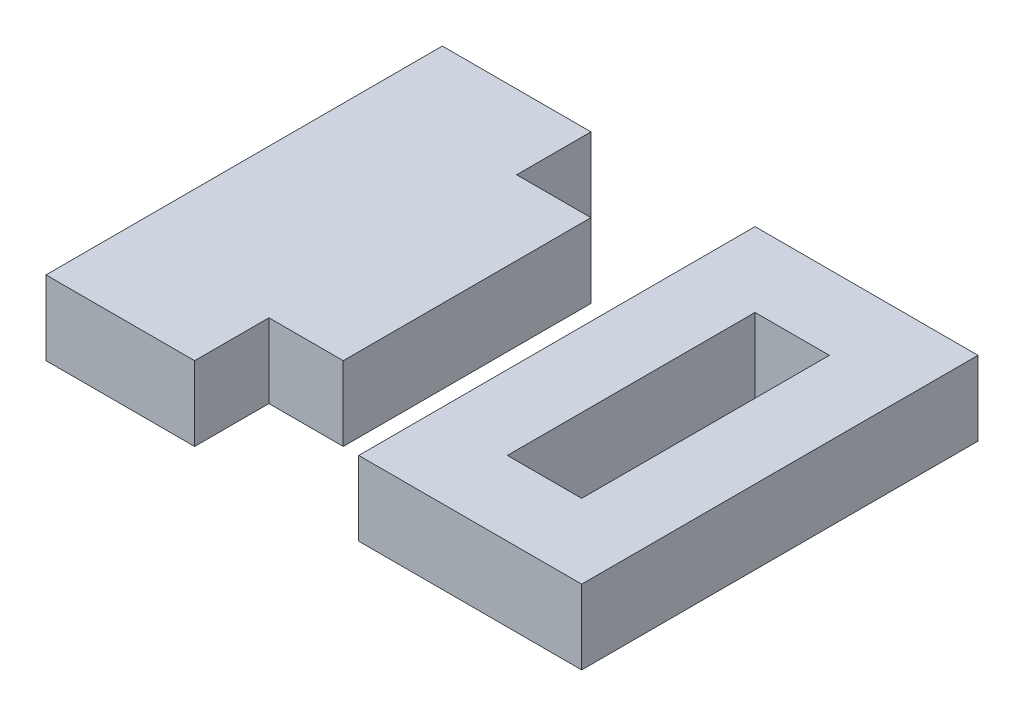
ISO-10303-21;
HEADER;
FILE_DESCRIPTION(('STEP AP214'),'2;1');
FILE_NAME('part.step','',(''),(''),'','','');
FILE_SCHEMA(('AUTOMOTIVE_DESIGN { 1 0 10303 214 1 1 1 1 }'));
ENDSEC;
DATA;
#1=APPLICATION_CONTEXT('core data for automotive mechanical design processes');
#2=APPLICATION_PROTOCOL_DEFINITION('international standard','automotive_design',2000,#1);
#3=PRODUCT_CONTEXT('',#1,'mechanical');
#4=PRODUCT('Part','Part','',(#3));
#5=PRODUCT_RELATED_PRODUCT_CATEGORY('part','',(#4));
#6=PRODUCT_DEFINITION_FORMATION('','',#4);
#7=PRODUCT_DEFINITION_CONTEXT('part definition',#1,'design');
#8=PRODUCT_DEFINITION('design','',#6,#7);
#9=PRODUCT_DEFINITION_SHAPE('','',#8);
#10=(LENGTH_UNIT() NAMED_UNIT(*) SI_UNIT(.MILLI.,.METRE.));
#11=(NAMED_UNIT(*) PLANE_ANGLE_UNIT() SI_UNIT($,.RADIAN.));
#12=(NAMED_UNIT(*) SI_UNIT($,.STERADIAN.) SOLID_ANGLE_UNIT());
#13=UNCERTAINTY_MEASURE_WITH_UNIT(LENGTH_MEASURE(1.E-05),#10,'distance_accuracy_value','');
#14=(GEOMETRIC_REPRESENTATION_CONTEXT(3) GLOBAL_UNCERTAINTY_ASSIGNED_CONTEXT((#13)) GLOBAL_UNIT_ASSIGNED_CONTEXT((#10,
#11,#12)) REPRESENTATION_CONTEXT('',''));
#15=CARTESIAN_POINT('',(0.,0.,0.));
#16=DIRECTION('',(0.,0.,1.));
#17=DIRECTION('',(1.,0.,0.));
#18=AXIS2_PLACEMENT_3D('',#15,#16,#17);
#19=CARTESIAN_POINT('',(0.,6.,-26.));
#20=DIRECTION('',(0.,0.,-1.));
#21=DIRECTION('',(-1.,0.,0.));
#22=AXIS2_PLACEMENT_3D('',#19,#20,#21);
#23=PLANE('',#22);
#24=DIRECTION('',(1.,0.,0.));
#25=VECTOR('',#24,1.);
#26=CARTESIAN_POINT('',(0.,0.,-26.));
#27=LINE('',#26,#25);
#28=CARTESIAN_POINT('',(-12.,0.,-26.));
#29=VERTEX_POINT('',#28);
#30=CARTESIAN_POINT('',(-6.,0.,-26.));
#31=VERTEX_POINT('',#30);
#32=EDGE_CURVE('E150',#29,#31,#27,.T.);
#33=ORIENTED_EDGE('',*,*,#32,.T.);
#34=DIRECTION('',(0.,-1.,0.));
#35=VECTOR('',#34,1.);
#36=CARTESIAN_POINT('',(-6.,6.,-26.));
#37=LINE('',#36,#35);
#38=CARTESIAN_POINT('',(-6.,6.,-26.));
#39=VERTEX_POINT('',#38);
#40=EDGE_CURVE('E12',#39,#31,#37,.T.);
#41=ORIENTED_EDGE('',*,*,#40,.F.);
#42=DIRECTION('',(1.,0.,0.));
#43=VECTOR('',#42,1.);
#44=CARTESIAN_POINT('',(0.,6.,-26.));
#45=LINE('',#44,#43);
#46=CARTESIAN_POINT('',(-12.,6.,-26.));
#47=VERTEX_POINT('',#46);
#48=EDGE_CURVE('E122',#47,#39,#45,.T.);
#49=ORIENTED_EDGE('',*,*,#48,.F.);
#50=DIRECTION('',(0.,-1.,0.));
#51=VECTOR('',#50,1.);
#52=CARTESIAN_POINT('',(-12.,6.,-26.));
#53=LINE('',#52,#51);
#54=EDGE_CURVE('E62',#47,#29,#53,.T.);
#55=ORIENTED_EDGE('',*,*,#54,.T.);
#56=EDGE_LOOP('',(#33,#41,#49,#55));
#57=FACE_BOUND('',#56,.T.);
#58=ADVANCED_FACE('F43',(#57),#23,.F.);
#59=CARTESIAN_POINT('',(-6.,6.,0.));
#60=DIRECTION('',(1.,0.,0.));
#61=DIRECTION('',(0.,0.,-1.));
#62=AXIS2_PLACEMENT_3D('',#59,#60,#61);
#63=PLANE('',#62);
#64=DIRECTION('',(0.,0.,1.));
#65=VECTOR('',#64,1.);
#66=CARTESIAN_POINT('',(-6.,0.,0.));
#67=LINE('',#66,#65);
#68=CARTESIAN_POINT('',(-6.,0.,-6.));
#69=VERTEX_POINT('',#68);
#70=EDGE_CURVE('E128',#31,#69,#67,.T.);
#71=ORIENTED_EDGE('',*,*,#70,.T.);
#72=DIRECTION('',(0.,-1.,0.));
#73=VECTOR('',#72,1.);
#74=CARTESIAN_POINT('',(-6.,6.,-6.));
#75=LINE('',#74,#73);
#76=CARTESIAN_POINT('',(-6.,6.,-6.));
#77=VERTEX_POINT('',#76);
#78=EDGE_CURVE('E53',#77,#69,#75,.T.);
#79=ORIENTED_EDGE('',*,*,#78,.F.);
#80=DIRECTION('',(0.,0.,1.));
#81=VECTOR('',#80,1.);
#82=CARTESIAN_POINT('',(-6.,6.,0.));
#83=LINE('',#82,#81);
#84=EDGE_CURVE('E116',#39,#77,#83,.T.);
#85=ORIENTED_EDGE('',*,*,#84,.F.);
#86=ORIENTED_EDGE('',*,*,#40,.T.);
#87=EDGE_LOOP('',(#71,#79,#85,#86));
#88=FACE_BOUND('',#87,.T.);
#89=ADVANCED_FACE('F127',(#88),#63,.F.);
#90=CARTESIAN_POINT('',(0.,6.,-6.));
#91=DIRECTION('',(0.,0.,-1.));
#92=DIRECTION('',(-1.,0.,0.));
#93=AXIS2_PLACEMENT_3D('',#90,#91,#92);
#94=PLANE('',#93);
#95=DIRECTION('',(1.,0.,0.));
#96=VECTOR('',#95,1.);
#97=CARTESIAN_POINT('',(0.,0.,-6.));
#98=LINE('',#97,#96);
#99=CARTESIAN_POINT('',(-12.,0.,-6.));
#100=VERTEX_POINT('',#99);
#101=EDGE_CURVE('E153',#100,#69,#98,.T.);
#102=ORIENTED_EDGE('',*,*,#101,.F.);
#103=DIRECTION('',(0.,-1.,0.));
#104=VECTOR('',#103,1.);
#105=CARTESIAN_POINT('',(-12.,6.,-6.));
#106=LINE('',#105,#104);
#107=CARTESIAN_POINT('',(-12.,6.,-6.));
#108=VERTEX_POINT('',#107);
#109=EDGE_CURVE('E88',#108,#100,#106,.T.);
#110=ORIENTED_EDGE('',*,*,#109,.F.);
#111=DIRECTION('',(1.,0.,0.));
#112=VECTOR('',#111,1.);
#113=CARTESIAN_POINT('',(0.,6.,-6.));
#114=LINE('',#113,#112);
#115=EDGE_CURVE('E121',#108,#77,#114,.T.);
#116=ORIENTED_EDGE('',*,*,#115,.T.);
#117=ORIENTED_EDGE('',*,*,#78,.T.);
#118=EDGE_LOOP('',(#102,#110,#116,#117));
#119=FACE_BOUND('',#118,.T.);
#120=ADVANCED_FACE('F132',(#119),#94,.T.);
#121=CARTESIAN_POINT('',(-18.,6.,0.));
#122=DIRECTION('',(-1.,0.,0.));
#123=DIRECTION('',(0.,0.,1.));
#124=AXIS2_PLACEMENT_3D('',#121,#122,#123);
#125=PLANE('',#124);
#126=DIRECTION('',(0.,0.,-1.));
#127=VECTOR('',#126,1.);
#128=CARTESIAN_POINT('',(-18.,0.,0.));
#129=LINE('',#128,#127);
#130=CARTESIAN_POINT('',(-18.,0.,0.));
#131=VERTEX_POINT('',#130);
#132=CARTESIAN_POINT('',(-18.,0.,-32.));
#133=VERTEX_POINT('',#132);
#134=EDGE_CURVE('E139',#131,#133,#129,.T.);
#135=ORIENTED_EDGE('',*,*,#134,.F.);
#136=DIRECTION('',(0.,-1.,0.));
#137=VECTOR('',#136,1.);
#138=CARTESIAN_POINT('',(-18.,6.,0.));
#139=LINE('',#138,#137);
#140=CARTESIAN_POINT('',(-18.,6.,0.));
#141=VERTEX_POINT('',#140);
#142=EDGE_CURVE('E47',#141,#131,#139,.T.);
#143=ORIENTED_EDGE('',*,*,#142,.F.);
#144=DIRECTION('',(0.,0.,-1.));
#145=VECTOR('',#144,1.);
#146=CARTESIAN_POINT('',(-18.,6.,0.));
#147=LINE('',#146,#145);
#148=CARTESIAN_POINT('',(-18.,6.,-32.));
#149=VERTEX_POINT('',#148);
#150=EDGE_CURVE('E158',#141,#149,#147,.T.);
#151=ORIENTED_EDGE('',*,*,#150,.T.);
#152=DIRECTION('',(0.,-1.,0.));
#153=VECTOR('',#152,1.);
#154=CARTESIAN_POINT('',(-18.,6.,-32.));
#155=LINE('',#154,#153);
#156=EDGE_CURVE('E135',#149,#133,#155,.T.);
#157=ORIENTED_EDGE('',*,*,#156,.T.);
#158=EDGE_LOOP('',(#135,#143,#151,#157));
#159=FACE_BOUND('',#158,.T.);
#160=ADVANCED_FACE('F45',(#159),#125,.T.);
#161=CARTESIAN_POINT('',(0.,6.,0.));
#162=DIRECTION('',(0.,0.,1.));
#163=DIRECTION('',(1.,0.,0.));
#164=AXIS2_PLACEMENT_3D('',#161,#162,#163);
#165=PLANE('',#164);
#166=DIRECTION('',(-1.,0.,0.));
#167=VECTOR('',#166,1.);
#168=CARTESIAN_POINT('',(0.,0.,0.));
#169=LINE('',#168,#167);
#170=CARTESIAN_POINT('',(0.,0.,0.));
#171=VERTEX_POINT('',#170);
#172=EDGE_CURVE('E142',#171,#131,#169,.T.);
#173=ORIENTED_EDGE('',*,*,#172,.F.);
#174=DIRECTION('',(0.,-1.,0.));
#175=VECTOR('',#174,1.);
#176=CARTESIAN_POINT('',(0.,6.,0.));
#177=LINE('',#176,#175);
#178=CARTESIAN_POINT('',(0.,6.,0.));
#179=VERTEX_POINT('',#178);
#180=EDGE_CURVE('E164',#179,#171,#177,.T.);
#181=ORIENTED_EDGE('',*,*,#180,.F.);
#182=DIRECTION('',(-1.,0.,0.));
#183=VECTOR('',#182,1.);
#184=CARTESIAN_POINT('',(0.,6.,0.));
#185=LINE('',#184,#183);
#186=EDGE_CURVE('E173',#179,#141,#185,.T.);
#187=ORIENTED_EDGE('',*,*,#186,.T.);
#188=ORIENTED_EDGE('',*,*,#142,.T.);
#189=EDGE_LOOP('',(#173,#181,#187,#188));
#190=FACE_BOUND('',#189,.T.);
#191=ADVANCED_FACE('F171',(#190),#165,.T.);
#192=CARTESIAN_POINT('',(0.,6.,0.));
#193=DIRECTION('',(-1.,0.,0.));
#194=DIRECTION('',(0.,0.,1.));
#195=AXIS2_PLACEMENT_3D('',#192,#193,#194);
#196=PLANE('',#195);
#197=DIRECTION('',(0.,0.,-1.));
#198=VECTOR('',#197,1.);
#199=CARTESIAN_POINT('',(0.,0.,0.));
#200=LINE('',#199,#198);
#201=CARTESIAN_POINT('',(0.,0.,-32.));
#202=VERTEX_POINT('',#201);
#203=EDGE_CURVE('E145',#171,#202,#200,.T.);
#204=ORIENTED_EDGE('',*,*,#203,.T.);
#205=DIRECTION('',(0.,-1.,0.));
#206=VECTOR('',#205,1.);
#207=CARTESIAN_POINT('',(0.,6.,-32.));
#208=LINE('',#207,#206);
#209=CARTESIAN_POINT('',(0.,6.,-32.));
#210=VERTEX_POINT('',#209);
#211=EDGE_CURVE('E162',#210,#202,#208,.T.);
#212=ORIENTED_EDGE('',*,*,#211,.F.);
#213=DIRECTION('',(0.,0.,-1.));
#214=VECTOR('',#213,1.);
#215=CARTESIAN_POINT('',(0.,6.,0.));
#216=LINE('',#215,#214);
#217=EDGE_CURVE('E186',#179,#210,#216,.T.);
#218=ORIENTED_EDGE('',*,*,#217,.F.);
#219=ORIENTED_EDGE('',*,*,#180,.T.);
#220=EDGE_LOOP('',(#204,#212,#218,#219));
#221=FACE_BOUND('',#220,.T.);
#222=ADVANCED_FACE('F180',(#221),#196,.F.);
#223=CARTESIAN_POINT('',(0.,6.,-32.));
#224=DIRECTION('',(0.,0.,1.));
#225=DIRECTION('',(1.,0.,0.));
#226=AXIS2_PLACEMENT_3D('',#223,#224,#225);
#227=PLANE('',#226);
#228=DIRECTION('',(-1.,0.,0.));
#229=VECTOR('',#228,1.);
#230=CARTESIAN_POINT('',(0.,0.,-32.));
#231=LINE('',#230,#229);
#232=EDGE_CURVE('E147',#202,#133,#231,.T.);
#233=ORIENTED_EDGE('',*,*,#232,.T.);
#234=ORIENTED_EDGE('',*,*,#156,.F.);
#235=DIRECTION('',(-1.,0.,0.));
#236=VECTOR('',#235,1.);
#237=CARTESIAN_POINT('',(0.,6.,-32.));
#238=LINE('',#237,#236);
#239=EDGE_CURVE('E184',#210,#149,#238,.T.);
#240=ORIENTED_EDGE('',*,*,#239,.F.);
#241=ORIENTED_EDGE('',*,*,#211,.T.);
#242=EDGE_LOOP('',(#233,#234,#240,#241));
#243=FACE_BOUND('',#242,.T.);
#244=ADVANCED_FACE('F183',(#243),#227,.F.);
#245=CARTESIAN_POINT('',(-12.,6.,0.));
#246=DIRECTION('',(1.,0.,0.));
#247=DIRECTION('',(0.,0.,-1.));
#248=AXIS2_PLACEMENT_3D('',#245,#246,#247);
#249=PLANE('',#248);
#250=DIRECTION('',(0.,0.,1.));
#251=VECTOR('',#250,1.);
#252=CARTESIAN_POINT('',(-12.,0.,0.));
#253=LINE('',#252,#251);
#254=EDGE_CURVE('E155',#29,#100,#253,.T.);
#255=ORIENTED_EDGE('',*,*,#254,.F.);
#256=ORIENTED_EDGE('',*,*,#54,.F.);
#257=DIRECTION('',(0.,0.,1.));
#258=VECTOR('',#257,1.);
#259=CARTESIAN_POINT('',(-12.,6.,0.));
#260=LINE('',#259,#258);
#261=EDGE_CURVE('E133',#47,#108,#260,.T.);
#262=ORIENTED_EDGE('',*,*,#261,.T.);
#263=ORIENTED_EDGE('',*,*,#109,.T.);
#264=EDGE_LOOP('',(#255,#256,#262,#263));
#265=FACE_BOUND('',#264,.T.);
#266=ADVANCED_FACE('F192',(#265),#249,.T.);
#267=CARTESIAN_POINT('',(0.,6.,0.));
#268=DIRECTION('',(0.,1.,0.));
#269=DIRECTION('',(0.,0.,1.));
#270=AXIS2_PLACEMENT_3D('',#267,#268,#269);
#271=PLANE('',#270);
#272=ORIENTED_EDGE('',*,*,#150,.F.);
#273=ORIENTED_EDGE('',*,*,#186,.F.);
#274=ORIENTED_EDGE('',*,*,#217,.T.);
#275=ORIENTED_EDGE('',*,*,#239,.T.);
#276=EDGE_LOOP('',(#272,#273,#274,#275));
#277=FACE_BOUND('',#276,.T.);
#278=ORIENTED_EDGE('',*,*,#48,.T.);
#279=ORIENTED_EDGE('',*,*,#84,.T.);
#280=ORIENTED_EDGE('',*,*,#115,.F.);
#281=ORIENTED_EDGE('',*,*,#261,.F.);
#282=EDGE_LOOP('',(#278,#279,#280,#281));
#283=FACE_BOUND('',#282,.T.);
#284=ADVANCED_FACE('F118',(#277,#283),#271,.T.);
#285=CARTESIAN_POINT('',(0.,0.,0.));
#286=DIRECTION('',(0.,1.,0.));
#287=DIRECTION('',(0.,0.,1.));
#288=AXIS2_PLACEMENT_3D('',#285,#286,#287);
#289=PLANE('',#288);
#290=ORIENTED_EDGE('',*,*,#134,.T.);
#291=ORIENTED_EDGE('',*,*,#232,.F.);
#292=ORIENTED_EDGE('',*,*,#203,.F.);
#293=ORIENTED_EDGE('',*,*,#172,.T.);
#294=EDGE_LOOP('',(#290,#291,#292,#293));
#295=FACE_BOUND('',#294,.T.);
#296=ORIENTED_EDGE('',*,*,#32,.F.);
#297=ORIENTED_EDGE('',*,*,#254,.T.);
#298=ORIENTED_EDGE('',*,*,#101,.T.);
#299=ORIENTED_EDGE('',*,*,#70,.F.);
#300=EDGE_LOOP('',(#296,#297,#298,#299));
#301=FACE_BOUND('',#300,.T.);
#302=ADVANCED_FACE('F177',(#295,#301),#289,.F.);
#303=CLOSED_SHELL('',(#58,#89,#120,#160,#191,#222,#244,#266,#284,#302));
#304=MANIFOLD_SOLID_BREP('B2',#303);
#305=CARTESIAN_POINT('',(0.,6.,-32.));
#306=DIRECTION('',(0.,0.,1.));
#307=DIRECTION('',(1.,0.,0.));
#308=AXIS2_PLACEMENT_3D('',#305,#306,#307);
#309=PLANE('',#308);
#310=DIRECTION('',(-1.,0.,0.));
#311=VECTOR('',#310,1.);
#312=CARTESIAN_POINT('',(0.,0.,-32.));
#313=LINE('',#312,#311);
#314=CARTESIAN_POINT('',(-31.25,0.,-32.));
#315=VERTEX_POINT('',#314);
#316=CARTESIAN_POINT('',(-43.25,0.,-32.));
#317=VERTEX_POINT('',#316);
#318=EDGE_CURVE('E371',#315,#317,#313,.T.);
#319=ORIENTED_EDGE('',*,*,#318,.T.);
#320=DIRECTION('',(0.,-1.,0.));
#321=VECTOR('',#320,1.);
#322=CARTESIAN_POINT('',(-43.25,6.,-32.));
#323=LINE('',#322,#321);
#324=CARTESIAN_POINT('',(-43.25,6.,-32.));
#325=VERTEX_POINT('',#324);
#326=EDGE_CURVE('E41',#325,#317,#323,.T.);
#327=ORIENTED_EDGE('',*,*,#326,.F.);
#328=DIRECTION('',(-1.,0.,0.));
#329=VECTOR('',#328,1.);
#330=CARTESIAN_POINT('',(0.,6.,-32.));
#331=LINE('',#330,#329);
#332=CARTESIAN_POINT('',(-31.25,6.,-32.));
#333=VERTEX_POINT('',#332);
#334=EDGE_CURVE('E411',#333,#325,#331,.T.);
#335=ORIENTED_EDGE('',*,*,#334,.F.);
#336=DIRECTION('',(0.,-1.,0.));
#337=VECTOR('',#336,1.);
#338=CARTESIAN_POINT('',(-31.25,6.,-32.));
#339=LINE('',#338,#337);
#340=EDGE_CURVE('E289',#333,#315,#339,.T.);
#341=ORIENTED_EDGE('',*,*,#340,.T.);
#342=EDGE_LOOP('',(#319,#327,#335,#341));
#343=FACE_BOUND('',#342,.T.);
#344=ADVANCED_FACE('F273',(#343),#309,.F.);
#345=CARTESIAN_POINT('',(-43.25,6.,0.));
#346=DIRECTION('',(1.,0.,0.));
#347=DIRECTION('',(0.,0.,-1.));
#348=AXIS2_PLACEMENT_3D('',#345,#346,#347);
#349=PLANE('',#348);
#350=DIRECTION('',(0.,0.,1.));
#351=VECTOR('',#350,1.);
#352=CARTESIAN_POINT('',(-43.25,0.,0.));
#353=LINE('',#352,#351);
#354=CARTESIAN_POINT('',(-43.25,0.,0.));
#355=VERTEX_POINT('',#354);
#356=EDGE_CURVE('E373',#317,#355,#353,.T.);
#357=ORIENTED_EDGE('',*,*,#356,.T.);
#358=DIRECTION('',(0.,-1.,0.));
#359=VECTOR('',#358,1.);
#360=CARTESIAN_POINT('',(-43.25,6.,0.));
#361=LINE('',#360,#359);
#362=CARTESIAN_POINT('',(-43.25,6.,0.));
#363=VERTEX_POINT('',#362);
#364=EDGE_CURVE('E281',#363,#355,#361,.T.);
#365=ORIENTED_EDGE('',*,*,#364,.F.);
#366=DIRECTION('',(0.,0.,1.));
#367=VECTOR('',#366,1.);
#368=CARTESIAN_POINT('',(-43.25,6.,0.));
#369=LINE('',#368,#367);
#370=EDGE_CURVE('E328',#325,#363,#369,.T.);
#371=ORIENTED_EDGE('',*,*,#370,.F.);
#372=ORIENTED_EDGE('',*,*,#326,.T.);
#373=EDGE_LOOP('',(#357,#365,#371,#372));
#374=FACE_BOUND('',#373,.T.);
#375=ADVANCED_FACE('F401',(#374),#349,.F.);
#376=CARTESIAN_POINT('',(0.,6.,0.));
#377=DIRECTION('',(0.,0.,1.));
#378=DIRECTION('',(1.,0.,0.));
#379=AXIS2_PLACEMENT_3D('',#376,#377,#378);
#380=PLANE('',#379);
#381=DIRECTION('',(-1.,0.,0.));
#382=VECTOR('',#381,1.);
#383=CARTESIAN_POINT('',(0.,0.,0.));
#384=LINE('',#383,#382);
#385=CARTESIAN_POINT('',(-31.25,0.,0.));
#386=VERTEX_POINT('',#385);
#387=EDGE_CURVE('E376',#386,#355,#384,.T.);
#388=ORIENTED_EDGE('',*,*,#387,.F.);
#389=DIRECTION('',(0.,-1.,0.));
#390=VECTOR('',#389,1.);
#391=CARTESIAN_POINT('',(-31.25,6.,0.));
#392=LINE('',#391,#390);
#393=CARTESIAN_POINT('',(-31.25,6.,0.));
#394=VERTEX_POINT('',#393);
#395=EDGE_CURVE('E394',#394,#386,#392,.T.);
#396=ORIENTED_EDGE('',*,*,#395,.F.);
#397=DIRECTION('',(-1.,0.,0.));
#398=VECTOR('',#397,1.);
#399=CARTESIAN_POINT('',(0.,6.,0.));
#400=LINE('',#399,#398);
#401=EDGE_CURVE('E400',#394,#363,#400,.T.);
#402=ORIENTED_EDGE('',*,*,#401,.T.);
#403=ORIENTED_EDGE('',*,*,#364,.T.);
#404=EDGE_LOOP('',(#388,#396,#402,#403));
#405=FACE_BOUND('',#404,.T.);
#406=ADVANCED_FACE('F398',(#405),#380,.T.);
#407=CARTESIAN_POINT('',(-31.25,6.,0.));
#408=DIRECTION('',(1.,0.,0.));
#409=DIRECTION('',(0.,0.,-1.));
#410=AXIS2_PLACEMENT_3D('',#407,#408,#409);
#411=PLANE('',#410);
#412=DIRECTION('',(0.,0.,1.));
#413=VECTOR('',#412,1.);
#414=CARTESIAN_POINT('',(-31.25,0.,0.));
#415=LINE('',#414,#413);
#416=CARTESIAN_POINT('',(-31.25,0.,-6.));
#417=VERTEX_POINT('',#416);
#418=EDGE_CURVE('E379',#417,#386,#415,.T.);
#419=ORIENTED_EDGE('',*,*,#418,.F.);
#420=DIRECTION('',(0.,-1.,0.));
#421=VECTOR('',#420,1.);
#422=CARTESIAN_POINT('',(-31.25,6.,-6.));
#423=LINE('',#422,#421);
#424=CARTESIAN_POINT('',(-31.25,6.,-6.));
#425=VERTEX_POINT('',#424);
#426=EDGE_CURVE('E392',#425,#417,#423,.T.);
#427=ORIENTED_EDGE('',*,*,#426,.F.);
#428=DIRECTION('',(0.,0.,1.));
#429=VECTOR('',#428,1.);
#430=CARTESIAN_POINT('',(-31.25,6.,0.));
#431=LINE('',#430,#429);
#432=EDGE_CURVE('E367',#425,#394,#431,.T.);
#433=ORIENTED_EDGE('',*,*,#432,.T.);
#434=ORIENTED_EDGE('',*,*,#395,.T.);
#435=EDGE_LOOP('',(#419,#427,#433,#434));
#436=FACE_BOUND('',#435,.T.);
#437=ADVANCED_FACE('F408',(#436),#411,.T.);
#438=CARTESIAN_POINT('',(0.,6.,-6.));
#439=DIRECTION('',(0.,0.,1.));
#440=DIRECTION('',(1.,0.,0.));
#441=AXIS2_PLACEMENT_3D('',#438,#439,#440);
#442=PLANE('',#441);
#443=DIRECTION('',(-1.,0.,0.));
#444=VECTOR('',#443,1.);
#445=CARTESIAN_POINT('',(0.,0.,-6.));
#446=LINE('',#445,#444);
#447=CARTESIAN_POINT('',(-25.25,0.,-6.));
#448=VERTEX_POINT('',#447);
#449=EDGE_CURVE('E382',#448,#417,#446,.T.);
#450=ORIENTED_EDGE('',*,*,#449,.F.);
#451=DIRECTION('',(0.,-1.,0.));
#452=VECTOR('',#451,1.);
#453=CARTESIAN_POINT('',(-25.25,6.,-6.));
#454=LINE('',#453,#452);
#455=CARTESIAN_POINT('',(-25.25,6.,-6.));
#456=VERTEX_POINT('',#455);
#457=EDGE_CURVE('E353',#456,#448,#454,.T.);
#458=ORIENTED_EDGE('',*,*,#457,.F.);
#459=DIRECTION('',(-1.,0.,0.));
#460=VECTOR('',#459,1.);
#461=CARTESIAN_POINT('',(0.,6.,-6.));
#462=LINE('',#461,#460);
#463=EDGE_CURVE('E365',#456,#425,#462,.T.);
#464=ORIENTED_EDGE('',*,*,#463,.T.);
#465=ORIENTED_EDGE('',*,*,#426,.T.);
#466=EDGE_LOOP('',(#450,#458,#464,#465));
#467=FACE_BOUND('',#466,.T.);
#468=ADVANCED_FACE('F426',(#467),#442,.T.);
#469=CARTESIAN_POINT('',(-25.25,6.,0.));
#470=DIRECTION('',(1.,0.,0.));
#471=DIRECTION('',(0.,0.,-1.));
#472=AXIS2_PLACEMENT_3D('',#469,#470,#471);
#473=PLANE('',#472);
#474=DIRECTION('',(0.,0.,1.));
#475=VECTOR('',#474,1.);
#476=CARTESIAN_POINT('',(-25.25,0.,0.));
#477=LINE('',#476,#475);
#478=CARTESIAN_POINT('',(-25.25,0.,-26.));
#479=VERTEX_POINT('',#478);
#480=EDGE_CURVE('E350',#479,#448,#477,.T.);
#481=ORIENTED_EDGE('',*,*,#480,.F.);
#482=DIRECTION('',(0.,-1.,0.));
#483=VECTOR('',#482,1.);
#484=CARTESIAN_POINT('',(-25.25,6.,-26.));
#485=LINE('',#484,#483);
#486=CARTESIAN_POINT('',(-25.25,6.,-26.));
#487=VERTEX_POINT('',#486);
#488=EDGE_CURVE('E344',#487,#479,#485,.T.);
#489=ORIENTED_EDGE('',*,*,#488,.F.);
#490=DIRECTION('',(0.,0.,1.));
#491=VECTOR('',#490,1.);
#492=CARTESIAN_POINT('',(-25.25,6.,0.));
#493=LINE('',#492,#491);
#494=EDGE_CURVE('E348',#487,#456,#493,.T.);
#495=ORIENTED_EDGE('',*,*,#494,.T.);
#496=ORIENTED_EDGE('',*,*,#457,.T.);
#497=EDGE_LOOP('',(#481,#489,#495,#496));
#498=FACE_BOUND('',#497,.T.);
#499=ADVANCED_FACE('F346',(#498),#473,.T.);
#500=CARTESIAN_POINT('',(0.,6.,-26.));
#501=DIRECTION('',(0.,0.,1.));
#502=DIRECTION('',(1.,0.,0.));
#503=AXIS2_PLACEMENT_3D('',#500,#501,#502);
#504=PLANE('',#503);
#505=DIRECTION('',(-1.,0.,0.));
#506=VECTOR('',#505,1.);
#507=CARTESIAN_POINT('',(0.,0.,-26.));
#508=LINE('',#507,#506);
#509=CARTESIAN_POINT('',(-31.25,0.,-26.));
#510=VERTEX_POINT('',#509);
#511=EDGE_CURVE('E387',#479,#510,#508,.T.);
#512=ORIENTED_EDGE('',*,*,#511,.T.);
#513=DIRECTION('',(0.,-1.,0.));
#514=VECTOR('',#513,1.);
#515=CARTESIAN_POINT('',(-31.25,6.,-26.));
#516=LINE('',#515,#514);
#517=CARTESIAN_POINT('',(-31.25,6.,-26.));
#518=VERTEX_POINT('',#517);
#519=EDGE_CURVE('E316',#518,#510,#516,.T.);
#520=ORIENTED_EDGE('',*,*,#519,.F.);
#521=DIRECTION('',(-1.,0.,0.));
#522=VECTOR('',#521,1.);
#523=CARTESIAN_POINT('',(0.,6.,-26.));
#524=LINE('',#523,#522);
#525=EDGE_CURVE('E355',#487,#518,#524,.T.);
#526=ORIENTED_EDGE('',*,*,#525,.F.);
#527=ORIENTED_EDGE('',*,*,#488,.T.);
#528=EDGE_LOOP('',(#512,#520,#526,#527));
#529=FACE_BOUND('',#528,.T.);
#530=ADVANCED_FACE('F356',(#529),#504,.F.);
#531=EDGE_CURVE('E383',#315,#510,#415,.T.);
#532=ORIENTED_EDGE('',*,*,#531,.F.);
#533=ORIENTED_EDGE('',*,*,#340,.F.);
#534=EDGE_CURVE('E359',#333,#518,#431,.T.);
#535=ORIENTED_EDGE('',*,*,#534,.T.);
#536=ORIENTED_EDGE('',*,*,#519,.T.);
#537=EDGE_LOOP('',(#532,#533,#535,#536));
#538=FACE_BOUND('',#537,.T.);
#539=ADVANCED_FACE('F415',(#538),#411,.T.);
#540=CARTESIAN_POINT('',(0.,6.,0.));
#541=DIRECTION('',(0.,1.,0.));
#542=DIRECTION('',(0.,0.,1.));
#543=AXIS2_PLACEMENT_3D('',#540,#541,#542);
#544=PLANE('',#543);
#545=ORIENTED_EDGE('',*,*,#334,.T.);
#546=ORIENTED_EDGE('',*,*,#370,.T.);
#547=ORIENTED_EDGE('',*,*,#401,.F.);
#548=ORIENTED_EDGE('',*,*,#432,.F.);
#549=ORIENTED_EDGE('',*,*,#463,.F.);
#550=ORIENTED_EDGE('',*,*,#494,.F.);
#551=ORIENTED_EDGE('',*,*,#525,.T.);
#552=ORIENTED_EDGE('',*,*,#534,.F.);
#553=EDGE_LOOP('',(#545,#546,#547,#548,#549,#550,#551,#552));
#554=FACE_BOUND('',#553,.T.);
#555=ADVANCED_FACE('F362',(#554),#544,.T.);
#556=CARTESIAN_POINT('',(0.,0.,0.));
#557=DIRECTION('',(0.,1.,0.));
#558=DIRECTION('',(0.,0.,1.));
#559=AXIS2_PLACEMENT_3D('',#556,#557,#558);
#560=PLANE('',#559);
#561=ORIENTED_EDGE('',*,*,#318,.F.);
#562=ORIENTED_EDGE('',*,*,#531,.T.);
#563=ORIENTED_EDGE('',*,*,#511,.F.);
#564=ORIENTED_EDGE('',*,*,#480,.T.);
#565=ORIENTED_EDGE('',*,*,#449,.T.);
#566=ORIENTED_EDGE('',*,*,#418,.T.);
#567=ORIENTED_EDGE('',*,*,#387,.T.);
#568=ORIENTED_EDGE('',*,*,#356,.F.);
#569=EDGE_LOOP('',(#561,#562,#563,#564,#565,#566,#567,#568));
#570=FACE_BOUND('',#569,.T.);
#571=ADVANCED_FACE('F404',(#570),#560,.F.);
#572=CLOSED_SHELL('',(#344,#375,#406,#437,#468,#499,#530,#539,#555,#571));
#573=MANIFOLD_SOLID_BREP('B6',#572);
#574=ADVANCED_BREP_SHAPE_REPRESENTATION('',(#18,#304,#573),#14);
#575=SHAPE_DEFINITION_REPRESENTATION(#9,#574);
ENDSEC;
END-ISO-10303-21;
